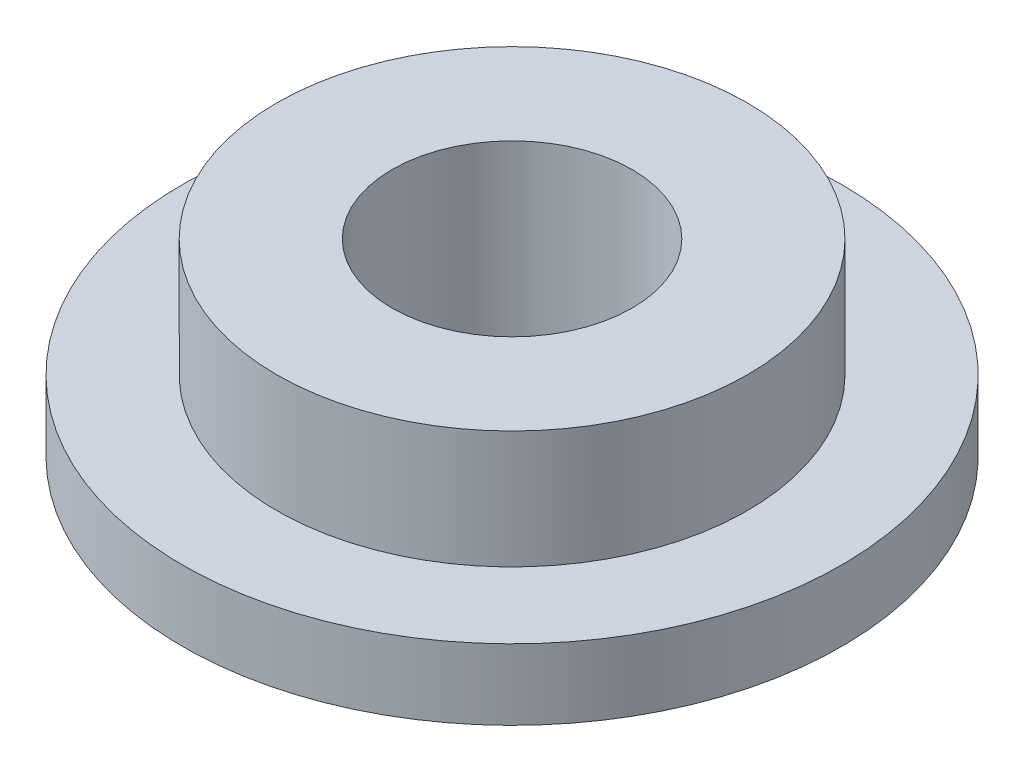
ISO-10303-21;
HEADER;
FILE_DESCRIPTION(('STEP AP214'),'2;1');
FILE_NAME('part.step','',(''),(''),'','','');
FILE_SCHEMA(('AUTOMOTIVE_DESIGN { 1 0 10303 214 1 1 1 1 }'));
ENDSEC;
DATA;
#1=APPLICATION_CONTEXT('core data for automotive mechanical design processes');
#2=APPLICATION_PROTOCOL_DEFINITION('international standard','automotive_design',2000,#1);
#3=PRODUCT_CONTEXT('',#1,'mechanical');
#4=PRODUCT('Part','Part','',(#3));
#5=PRODUCT_RELATED_PRODUCT_CATEGORY('part','',(#4));
#6=PRODUCT_DEFINITION_FORMATION('','',#4);
#7=PRODUCT_DEFINITION_CONTEXT('part definition',#1,'design');
#8=PRODUCT_DEFINITION('design','',#6,#7);
#9=PRODUCT_DEFINITION_SHAPE('','',#8);
#10=(LENGTH_UNIT() NAMED_UNIT(*) SI_UNIT(.MILLI.,.METRE.));
#11=(NAMED_UNIT(*) PLANE_ANGLE_UNIT() SI_UNIT($,.RADIAN.));
#12=(NAMED_UNIT(*) SI_UNIT($,.STERADIAN.) SOLID_ANGLE_UNIT());
#13=UNCERTAINTY_MEASURE_WITH_UNIT(LENGTH_MEASURE(1.E-05),#10,'distance_accuracy_value','');
#14=(GEOMETRIC_REPRESENTATION_CONTEXT(3) GLOBAL_UNCERTAINTY_ASSIGNED_CONTEXT((#13)) GLOBAL_UNIT_ASSIGNED_CONTEXT((#10,
#11,#12)) REPRESENTATION_CONTEXT('',''));
#15=CARTESIAN_POINT('',(0.,0.,0.));
#16=DIRECTION('',(0.,0.,1.));
#17=DIRECTION('',(1.,0.,0.));
#18=AXIS2_PLACEMENT_3D('',#15,#16,#17);
#19=CARTESIAN_POINT('',(0.,4.,0.));
#20=DIRECTION('',(0.,-1.,0.));
#21=DIRECTION('',(0.,0.,-1.));
#22=AXIS2_PLACEMENT_3D('',#19,#20,#21);
#23=CYLINDRICAL_SURFACE('',#22,5.);
#24=CARTESIAN_POINT('',(0.,4.,0.));
#25=DIRECTION('',(0.,1.,0.));
#26=DIRECTION('',(0.,0.,1.));
#27=AXIS2_PLACEMENT_3D('',#24,#25,#26);
#28=CIRCLE('',#27,5.);
#29=CARTESIAN_POINT('',(0.,4.,5.));
#30=VERTEX_POINT('',#29);
#31=EDGE_CURVE('E37',#30,#30,#28,.T.);
#32=ORIENTED_EDGE('',*,*,#31,.F.);
#33=EDGE_LOOP('',(#32));
#34=FACE_BOUND('',#33,.T.);
#35=CARTESIAN_POINT('',(0.,1.5,0.));
#36=DIRECTION('',(0.,-1.,0.));
#37=DIRECTION('',(0.,0.,-1.));
#38=AXIS2_PLACEMENT_3D('',#35,#36,#37);
#39=CIRCLE('',#38,5.);
#40=CARTESIAN_POINT('',(0.,1.5,-5.));
#41=VERTEX_POINT('',#40);
#42=EDGE_CURVE('E10',#41,#41,#39,.T.);
#43=ORIENTED_EDGE('',*,*,#42,.F.);
#44=EDGE_LOOP('',(#43));
#45=FACE_BOUND('',#44,.T.);
#46=ADVANCED_FACE('F31',(#34,#45),#23,.T.);
#47=CARTESIAN_POINT('',(0.,4.,0.));
#48=DIRECTION('',(0.,1.,0.));
#49=DIRECTION('',(0.,0.,1.));
#50=AXIS2_PLACEMENT_3D('',#47,#48,#49);
#51=PLANE('',#50);
#52=ORIENTED_EDGE('',*,*,#31,.T.);
#53=EDGE_LOOP('',(#52));
#54=FACE_BOUND('',#53,.T.);
#55=CARTESIAN_POINT('',(0.,4.,0.));
#56=DIRECTION('',(0.,1.,0.));
#57=DIRECTION('',(0.,0.,1.));
#58=AXIS2_PLACEMENT_3D('',#55,#56,#57);
#59=CIRCLE('',#58,2.55);
#60=CARTESIAN_POINT('',(0.,4.,2.55));
#61=VERTEX_POINT('',#60);
#62=EDGE_CURVE('E41',#61,#61,#59,.T.);
#63=ORIENTED_EDGE('',*,*,#62,.F.);
#64=EDGE_LOOP('',(#63));
#65=FACE_BOUND('',#64,.T.);
#66=ADVANCED_FACE('F69',(#54,#65),#51,.T.);
#67=CARTESIAN_POINT('',(0.,0.,0.));
#68=DIRECTION('',(0.,1.,0.));
#69=DIRECTION('',(0.,0.,1.));
#70=AXIS2_PLACEMENT_3D('',#67,#68,#69);
#71=PLANE('',#70);
#72=CARTESIAN_POINT('',(0.,0.,0.));
#73=DIRECTION('',(0.,1.,0.));
#74=DIRECTION('',(0.,0.,1.));
#75=AXIS2_PLACEMENT_3D('',#72,#73,#74);
#76=CIRCLE('',#75,2.55);
#77=CARTESIAN_POINT('',(0.,0.,2.55));
#78=VERTEX_POINT('',#77);
#79=EDGE_CURVE('E45',#78,#78,#76,.T.);
#80=ORIENTED_EDGE('',*,*,#79,.T.);
#81=EDGE_LOOP('',(#80));
#82=FACE_BOUND('',#81,.T.);
#83=CARTESIAN_POINT('',(0.,0.,0.));
#84=DIRECTION('',(0.,-1.,0.));
#85=DIRECTION('',(0.,0.,-1.));
#86=AXIS2_PLACEMENT_3D('',#83,#84,#85);
#87=CIRCLE('',#86,7.);
#88=CARTESIAN_POINT('',(0.,0.,-7.));
#89=VERTEX_POINT('',#88);
#90=EDGE_CURVE('E51',#89,#89,#87,.T.);
#91=ORIENTED_EDGE('',*,*,#90,.T.);
#92=EDGE_LOOP('',(#91));
#93=FACE_BOUND('',#92,.T.);
#94=ADVANCED_FACE('F74',(#82,#93),#71,.F.);
#95=CARTESIAN_POINT('',(0.,4.,0.));
#96=DIRECTION('',(0.,-1.,0.));
#97=DIRECTION('',(0.,0.,-1.));
#98=AXIS2_PLACEMENT_3D('',#95,#96,#97);
#99=CYLINDRICAL_SURFACE('',#98,2.55);
#100=ORIENTED_EDGE('',*,*,#62,.T.);
#101=EDGE_LOOP('',(#100));
#102=FACE_BOUND('',#101,.T.);
#103=ORIENTED_EDGE('',*,*,#79,.F.);
#104=EDGE_LOOP('',(#103));
#105=FACE_BOUND('',#104,.T.);
#106=ADVANCED_FACE('F66',(#102,#105),#99,.F.);
#107=CARTESIAN_POINT('',(0.,1.5,0.));
#108=DIRECTION('',(0.,-1.,0.));
#109=DIRECTION('',(0.,0.,-1.));
#110=AXIS2_PLACEMENT_3D('',#107,#108,#109);
#111=CYLINDRICAL_SURFACE('',#110,7.);
#112=CARTESIAN_POINT('',(0.,1.5,0.));
#113=DIRECTION('',(0.,-1.,0.));
#114=DIRECTION('',(0.,0.,-1.));
#115=AXIS2_PLACEMENT_3D('',#112,#113,#114);
#116=CIRCLE('',#115,7.);
#117=CARTESIAN_POINT('',(0.,1.5,-7.));
#118=VERTEX_POINT('',#117);
#119=EDGE_CURVE('E49',#118,#118,#116,.T.);
#120=ORIENTED_EDGE('',*,*,#119,.T.);
#121=EDGE_LOOP('',(#120));
#122=FACE_BOUND('',#121,.T.);
#123=ORIENTED_EDGE('',*,*,#90,.F.);
#124=EDGE_LOOP('',(#123));
#125=FACE_BOUND('',#124,.T.);
#126=ADVANCED_FACE('F57',(#122,#125),#111,.T.);
#127=CARTESIAN_POINT('',(0.,1.5,0.));
#128=DIRECTION('',(0.,-1.,0.));
#129=DIRECTION('',(0.,0.,-1.));
#130=AXIS2_PLACEMENT_3D('',#127,#128,#129);
#131=PLANE('',#130);
#132=ORIENTED_EDGE('',*,*,#42,.T.);
#133=EDGE_LOOP('',(#132));
#134=FACE_BOUND('',#133,.T.);
#135=ORIENTED_EDGE('',*,*,#119,.F.);
#136=EDGE_LOOP('',(#135));
#137=FACE_BOUND('',#136,.T.);
#138=ADVANCED_FACE('F60',(#134,#137),#131,.F.);
#139=CLOSED_SHELL('',(#46,#66,#94,#106,#126,#138));
#140=MANIFOLD_SOLID_BREP('B2',#139);
#141=ADVANCED_BREP_SHAPE_REPRESENTATION('',(#18,#140),#14);
#142=SHAPE_DEFINITION_REPRESENTATION(#9,#141);
ENDSEC;
END-ISO-10303-21;
